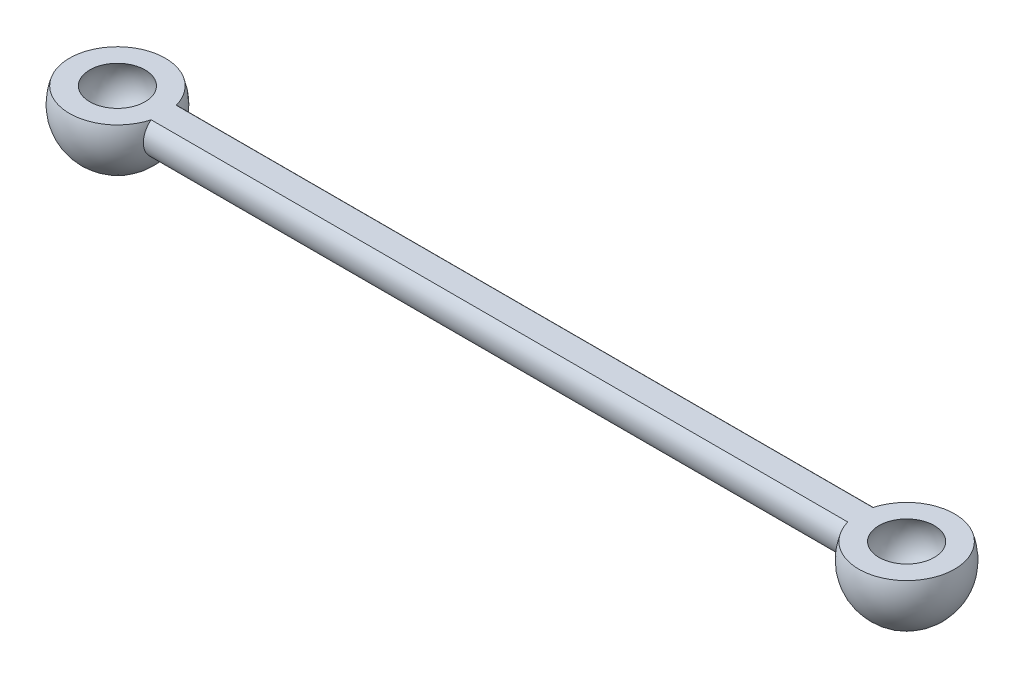
ISO-10303-21;
HEADER;
FILE_DESCRIPTION(('STEP AP214'),'2;1');
FILE_NAME('part.step','',(''),(''),'','','');
FILE_SCHEMA(('AUTOMOTIVE_DESIGN { 1 0 10303 214 1 1 1 1 }'));
ENDSEC;
DATA;
#1=APPLICATION_CONTEXT('core data for automotive mechanical design processes');
#2=APPLICATION_PROTOCOL_DEFINITION('international standard','automotive_design',2000,#1);
#3=PRODUCT_CONTEXT('',#1,'mechanical');
#4=PRODUCT('Part','Part','',(#3));
#5=PRODUCT_RELATED_PRODUCT_CATEGORY('part','',(#4));
#6=PRODUCT_DEFINITION_FORMATION('','',#4);
#7=PRODUCT_DEFINITION_CONTEXT('part definition',#1,'design');
#8=PRODUCT_DEFINITION('design','',#6,#7);
#9=PRODUCT_DEFINITION_SHAPE('','',#8);
#10=(LENGTH_UNIT() NAMED_UNIT(*) SI_UNIT(.MILLI.,.METRE.));
#11=(NAMED_UNIT(*) PLANE_ANGLE_UNIT() SI_UNIT($,.RADIAN.));
#12=(NAMED_UNIT(*) SI_UNIT($,.STERADIAN.) SOLID_ANGLE_UNIT());
#13=UNCERTAINTY_MEASURE_WITH_UNIT(LENGTH_MEASURE(1.E-05),#10,'distance_accuracy_value','');
#14=(GEOMETRIC_REPRESENTATION_CONTEXT(3) GLOBAL_UNCERTAINTY_ASSIGNED_CONTEXT((#13)) GLOBAL_UNIT_ASSIGNED_CONTEXT((#10,
#11,#12)) REPRESENTATION_CONTEXT('',''));
#15=CARTESIAN_POINT('',(0.,0.,0.));
#16=DIRECTION('',(0.,0.,1.));
#17=DIRECTION('',(1.,0.,0.));
#18=AXIS2_PLACEMENT_3D('',#15,#16,#17);
#19=CARTESIAN_POINT('',(67.9649231006959,0.,0.));
#20=DIRECTION('',(-1.,0.,0.));
#21=DIRECTION('',(0.,0.,-1.));
#22=AXIS2_PLACEMENT_3D('',#19,#20,#21);
#23=SPHERICAL_SURFACE('',#22,5.5);
#24=CARTESIAN_POINT('',(67.9649231006959,0.,0.));
#25=DIRECTION('',(0.,-1.,0.));
#26=DIRECTION('',(1.,0.,0.));
#27=AXIS2_PLACEMENT_3D('',#24,#25,#26);
#28=SPHERICAL_SURFACE('',#27,5.5);
#29=CARTESIAN_POINT('',(67.9649231006959,2.75,0.));
#30=DIRECTION('',(0.,-1.,0.));
#31=DIRECTION('',(1.,0.,0.));
#32=AXIS2_PLACEMENT_3D('',#29,#30,#31);
#33=CIRCLE('',#32,4.76313972081442);
#34=CARTESIAN_POINT('',(72.7280628215104,2.75,0.));
#35=VERTEX_POINT('',#34);
#36=EDGE_CURVE('E44',#35,#35,#33,.T.);
#37=ORIENTED_EDGE('',*,*,#36,.F.);
#38=EDGE_LOOP('',(#37));
#39=FACE_BOUND('',#38,.T.);
#40=ADVANCED_FACE('F40',(#39),#28,.F.);
#41=CARTESIAN_POINT('',(-310.,2.75,8.25393845385341));
#42=DIRECTION('',(0.,-1.,0.));
#43=DIRECTION('',(1.,0.,0.));
#44=AXIS2_PLACEMENT_3D('',#41,#42,#43);
#45=PLANE('',#44);
#46=CARTESIAN_POINT('',(67.9649231006959,2.75,0.));
#47=DIRECTION('',(0.,-1.,0.));
#48=DIRECTION('',(1.,0.,0.));
#49=AXIS2_PLACEMENT_3D('',#46,#47,#48);
#50=CIRCLE('',#49,8.25393845385341);
#51=CARTESIAN_POINT('',(60.,2.75,2.16506350946108));
#52=VERTEX_POINT('',#51);
#53=CARTESIAN_POINT('',(60.,2.75,-2.16506350946108));
#54=VERTEX_POINT('',#53);
#55=EDGE_CURVE('E56',#52,#54,#50,.F.);
#56=ORIENTED_EDGE('',*,*,#55,.T.);
#57=DIRECTION('',(-1.,0.,0.));
#58=VECTOR('',#57,1.);
#59=CARTESIAN_POINT('',(-76.6649231006959,2.75,-2.16506350946108));
#60=LINE('',#59,#58);
#61=CARTESIAN_POINT('',(-60.,2.75,-2.16506350946109));
#62=VERTEX_POINT('',#61);
#63=EDGE_CURVE('E71',#62,#54,#60,.F.);
#64=ORIENTED_EDGE('',*,*,#63,.F.);
#65=CARTESIAN_POINT('',(-67.9649231006959,2.75,0.));
#66=DIRECTION('',(0.,-1.,0.));
#67=DIRECTION('',(1.,0.,0.));
#68=AXIS2_PLACEMENT_3D('',#65,#66,#67);
#69=CIRCLE('',#68,8.25393845385341);
#70=CARTESIAN_POINT('',(-60.,2.75,2.16506350946109));
#71=VERTEX_POINT('',#70);
#72=EDGE_CURVE('E63',#71,#62,#69,.T.);
#73=ORIENTED_EDGE('',*,*,#72,.F.);
#74=DIRECTION('',(-1.,0.,0.));
#75=VECTOR('',#74,1.);
#76=CARTESIAN_POINT('',(-76.6649231006959,2.75,2.16506350946108));
#77=LINE('',#76,#75);
#78=EDGE_CURVE('E70',#52,#71,#77,.T.);
#79=ORIENTED_EDGE('',*,*,#78,.F.);
#80=EDGE_LOOP('',(#56,#64,#73,#79));
#81=FACE_BOUND('',#80,.T.);
#82=ORIENTED_EDGE('',*,*,#36,.T.);
#83=EDGE_LOOP('',(#82));
#84=FACE_BOUND('',#83,.T.);
#85=CARTESIAN_POINT('',(-67.9649231006959,2.75,0.));
#86=DIRECTION('',(0.,-1.,0.));
#87=DIRECTION('',(1.,0.,0.));
#88=AXIS2_PLACEMENT_3D('',#85,#86,#87);
#89=CIRCLE('',#88,4.76313972081442);
#90=CARTESIAN_POINT('',(-63.2017833798815,2.75,0.));
#91=VERTEX_POINT('',#90);
#92=EDGE_CURVE('E73',#91,#91,#89,.F.);
#93=ORIENTED_EDGE('',*,*,#92,.F.);
#94=EDGE_LOOP('',(#93));
#95=FACE_BOUND('',#94,.T.);
#96=ADVANCED_FACE('F68',(#81,#84,#95),#45,.F.);
#97=CARTESIAN_POINT('',(-67.9649231006959,0.,0.));
#98=DIRECTION('',(-1.,0.,0.));
#99=DIRECTION('',(0.,0.,-1.));
#100=AXIS2_PLACEMENT_3D('',#97,#98,#99);
#101=SPHERICAL_SURFACE('',#100,5.5);
#102=CARTESIAN_POINT('',(-67.9649231006959,0.,0.));
#103=DIRECTION('',(0.,-1.,0.));
#104=DIRECTION('',(1.,0.,0.));
#105=AXIS2_PLACEMENT_3D('',#102,#103,#104);
#106=SPHERICAL_SURFACE('',#105,5.5);
#107=ORIENTED_EDGE('',*,*,#92,.T.);
#108=EDGE_LOOP('',(#107));
#109=FACE_BOUND('',#108,.T.);
#110=ADVANCED_FACE('F42',(#109),#106,.F.);
#111=CARTESIAN_POINT('',(67.9649231006959,0.,0.));
#112=DIRECTION('',(-1.,0.,0.));
#113=DIRECTION('',(0.,0.,-1.));
#114=AXIS2_PLACEMENT_3D('',#111,#112,#113);
#115=SPHERICAL_SURFACE('',#114,8.7);
#116=ORIENTED_EDGE('',*,*,#55,.F.);
#117=CARTESIAN_POINT('',(60.,0.,0.));
#118=DIRECTION('',(-1.,0.,0.));
#119=DIRECTION('',(0.,0.,1.));
#120=AXIS2_PLACEMENT_3D('',#117,#118,#119);
#121=CIRCLE('',#120,3.49999999999999);
#122=EDGE_CURVE('E11',#54,#52,#121,.T.);
#123=ORIENTED_EDGE('',*,*,#122,.F.);
#124=EDGE_LOOP('',(#116,#123));
#125=FACE_BOUND('',#124,.T.);
#126=ADVANCED_FACE('F97',(#125),#115,.T.);
#127=CARTESIAN_POINT('',(-76.6649231006959,0.,0.));
#128=DIRECTION('',(-1.,0.,0.));
#129=DIRECTION('',(0.,0.,1.));
#130=AXIS2_PLACEMENT_3D('',#127,#128,#129);
#131=CYLINDRICAL_SURFACE('',#130,3.49999999999999);
#132=ORIENTED_EDGE('',*,*,#122,.T.);
#133=ORIENTED_EDGE('',*,*,#78,.T.);
#134=CARTESIAN_POINT('',(-60.,0.,0.));
#135=DIRECTION('',(-1.,0.,0.));
#136=DIRECTION('',(0.,0.,1.));
#137=AXIS2_PLACEMENT_3D('',#134,#135,#136);
#138=CIRCLE('',#137,3.49999999999999);
#139=EDGE_CURVE('E49',#62,#71,#138,.T.);
#140=ORIENTED_EDGE('',*,*,#139,.F.);
#141=ORIENTED_EDGE('',*,*,#63,.T.);
#142=EDGE_LOOP('',(#132,#133,#140,#141));
#143=FACE_BOUND('',#142,.T.);
#144=ADVANCED_FACE('F76',(#143),#131,.T.);
#145=CARTESIAN_POINT('',(-67.9649231006959,0.,0.));
#146=DIRECTION('',(-1.,0.,0.));
#147=DIRECTION('',(0.,0.,-1.));
#148=AXIS2_PLACEMENT_3D('',#145,#146,#147);
#149=SPHERICAL_SURFACE('',#148,8.7);
#150=ORIENTED_EDGE('',*,*,#72,.T.);
#151=ORIENTED_EDGE('',*,*,#139,.T.);
#152=EDGE_LOOP('',(#150,#151));
#153=FACE_BOUND('',#152,.T.);
#154=ADVANCED_FACE('F79',(#153),#149,.T.);
#155=CLOSED_SHELL('',(#40,#96,#110,#126,#144,#154));
#156=MANIFOLD_SOLID_BREP('B2',#155);
#157=ADVANCED_BREP_SHAPE_REPRESENTATION('',(#18,#156),#14);
#158=SHAPE_DEFINITION_REPRESENTATION(#9,#157);
ENDSEC;
END-ISO-10303-21;
